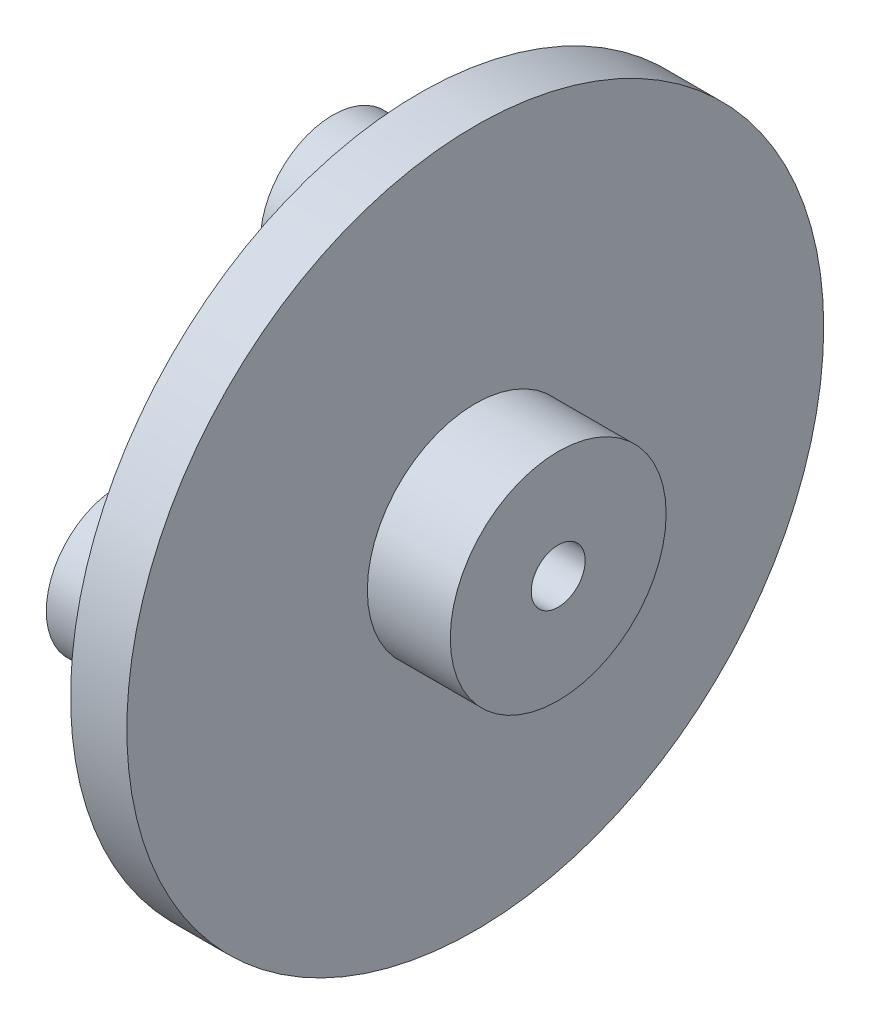
ISO-10303-21;
HEADER;
FILE_DESCRIPTION(('STEP AP214'),'2;1');
FILE_NAME('part.step','',(''),(''),'','','');
FILE_SCHEMA(('AUTOMOTIVE_DESIGN { 1 0 10303 214 1 1 1 1 }'));
ENDSEC;
DATA;
#1=APPLICATION_CONTEXT('core data for automotive mechanical design processes');
#2=APPLICATION_PROTOCOL_DEFINITION('international standard','automotive_design',2000,#1);
#3=PRODUCT_CONTEXT('',#1,'mechanical');
#4=PRODUCT('Part','Part','',(#3));
#5=PRODUCT_RELATED_PRODUCT_CATEGORY('part','',(#4));
#6=PRODUCT_DEFINITION_FORMATION('','',#4);
#7=PRODUCT_DEFINITION_CONTEXT('part definition',#1,'design');
#8=PRODUCT_DEFINITION('design','',#6,#7);
#9=PRODUCT_DEFINITION_SHAPE('','',#8);
#10=(LENGTH_UNIT() NAMED_UNIT(*) SI_UNIT(.MILLI.,.METRE.));
#11=(NAMED_UNIT(*) PLANE_ANGLE_UNIT() SI_UNIT($,.RADIAN.));
#12=(NAMED_UNIT(*) SI_UNIT($,.STERADIAN.) SOLID_ANGLE_UNIT());
#13=UNCERTAINTY_MEASURE_WITH_UNIT(LENGTH_MEASURE(1.E-05),#10,'distance_accuracy_value','');
#14=(GEOMETRIC_REPRESENTATION_CONTEXT(3) GLOBAL_UNCERTAINTY_ASSIGNED_CONTEXT((#13)) GLOBAL_UNIT_ASSIGNED_CONTEXT((#10,
#11,#12)) REPRESENTATION_CONTEXT('',''));
#15=CARTESIAN_POINT('',(0.,0.,0.));
#16=DIRECTION('',(0.,0.,1.));
#17=DIRECTION('',(1.,0.,0.));
#18=AXIS2_PLACEMENT_3D('',#15,#16,#17);
#19=CARTESIAN_POINT('',(-8.1873872368468,0.,0.));
#20=DIRECTION('',(1.,0.,0.));
#21=DIRECTION('',(0.,0.,-1.));
#22=AXIS2_PLACEMENT_3D('',#19,#20,#21);
#23=PLANE('',#22);
#24=CARTESIAN_POINT('',(-8.1873872368468,1.3197799460827E-13,-12.6));
#25=DIRECTION('',(1.,0.,0.));
#26=DIRECTION('',(0.,0.,-1.));
#27=AXIS2_PLACEMENT_3D('',#24,#25,#26);
#28=CIRCLE('',#27,4.25);
#29=CARTESIAN_POINT('',(-8.1873872368468,1.3197799460827E-13,-16.85));
#30=VERTEX_POINT('',#29);
#31=EDGE_CURVE('E10',#30,#30,#28,.F.);
#32=ORIENTED_EDGE('',*,*,#31,.F.);
#33=EDGE_LOOP('',(#32));
#34=FACE_BOUND('',#33,.T.);
#35=CARTESIAN_POINT('',(-8.1873872368468,-12.6,0.));
#36=DIRECTION('',(1.,0.,0.));
#37=DIRECTION('',(0.,0.,-1.));
#38=AXIS2_PLACEMENT_3D('',#35,#36,#37);
#39=CIRCLE('',#38,4.25);
#40=CARTESIAN_POINT('',(-8.1873872368468,-12.6,-4.25000000000009));
#41=VERTEX_POINT('',#40);
#42=EDGE_CURVE('E52',#41,#41,#39,.F.);
#43=ORIENTED_EDGE('',*,*,#42,.F.);
#44=EDGE_LOOP('',(#43));
#45=FACE_BOUND('',#44,.T.);
#46=CARTESIAN_POINT('',(-8.1873872368468,0.,12.6));
#47=DIRECTION('',(1.,0.,0.));
#48=DIRECTION('',(0.,0.,-1.));
#49=AXIS2_PLACEMENT_3D('',#46,#47,#48);
#50=CIRCLE('',#49,4.25);
#51=CARTESIAN_POINT('',(-8.1873872368468,0.,8.35));
#52=VERTEX_POINT('',#51);
#53=EDGE_CURVE('E57',#52,#52,#50,.F.);
#54=ORIENTED_EDGE('',*,*,#53,.F.);
#55=EDGE_LOOP('',(#54));
#56=FACE_BOUND('',#55,.T.);
#57=CARTESIAN_POINT('',(-8.1873872368468,12.6,0.));
#58=DIRECTION('',(1.,0.,0.));
#59=DIRECTION('',(0.,0.,-1.));
#60=AXIS2_PLACEMENT_3D('',#57,#58,#59);
#61=CIRCLE('',#60,4.25);
#62=CARTESIAN_POINT('',(-8.1873872368468,12.6,-4.25));
#63=VERTEX_POINT('',#62);
#64=EDGE_CURVE('E62',#63,#63,#61,.F.);
#65=ORIENTED_EDGE('',*,*,#64,.F.);
#66=EDGE_LOOP('',(#65));
#67=FACE_BOUND('',#66,.T.);
#68=CARTESIAN_POINT('',(-8.1873872368468,0.,0.));
#69=DIRECTION('',(1.,0.,0.));
#70=DIRECTION('',(0.,0.,-1.));
#71=AXIS2_PLACEMENT_3D('',#68,#69,#70);
#72=CIRCLE('',#71,20.5);
#73=CARTESIAN_POINT('',(-8.1873872368468,0.,-20.5));
#74=VERTEX_POINT('',#73);
#75=EDGE_CURVE('E88',#74,#74,#72,.T.);
#76=ORIENTED_EDGE('',*,*,#75,.F.);
#77=EDGE_LOOP('',(#76));
#78=FACE_BOUND('',#77,.T.);
#79=CARTESIAN_POINT('',(-8.1873872368468,0.,0.));
#80=DIRECTION('',(1.,0.,0.));
#81=DIRECTION('',(0.,0.,-1.));
#82=AXIS2_PLACEMENT_3D('',#79,#80,#81);
#83=CIRCLE('',#82,1.5875);
#84=CARTESIAN_POINT('',(-8.1873872368468,0.,-1.5875));
#85=VERTEX_POINT('',#84);
#86=EDGE_CURVE('E68',#85,#85,#83,.T.);
#87=ORIENTED_EDGE('',*,*,#86,.T.);
#88=EDGE_LOOP('',(#87));
#89=FACE_BOUND('',#88,.T.);
#90=ADVANCED_FACE('F45',(#34,#45,#56,#67,#78,#89),#23,.F.);
#91=CARTESIAN_POINT('',(0.,0.,0.));
#92=DIRECTION('',(1.,0.,0.));
#93=DIRECTION('',(0.,0.,-1.));
#94=AXIS2_PLACEMENT_3D('',#91,#92,#93);
#95=CYLINDRICAL_SURFACE('',#94,1.5875);
#96=CARTESIAN_POINT('',(0.,0.,0.));
#97=DIRECTION('',(1.,0.,0.));
#98=DIRECTION('',(0.,0.,-1.));
#99=AXIS2_PLACEMENT_3D('',#96,#97,#98);
#100=CIRCLE('',#99,1.5875);
#101=CARTESIAN_POINT('',(0.,0.,-1.5875));
#102=VERTEX_POINT('',#101);
#103=EDGE_CURVE('E72',#102,#102,#100,.T.);
#104=ORIENTED_EDGE('',*,*,#103,.T.);
#105=EDGE_LOOP('',(#104));
#106=FACE_BOUND('',#105,.T.);
#107=ORIENTED_EDGE('',*,*,#86,.F.);
#108=EDGE_LOOP('',(#107));
#109=FACE_BOUND('',#108,.T.);
#110=ADVANCED_FACE('F124',(#106,#109),#95,.F.);
#111=CARTESIAN_POINT('',(0.,0.,0.));
#112=DIRECTION('',(1.,0.,0.));
#113=DIRECTION('',(0.,0.,-1.));
#114=AXIS2_PLACEMENT_3D('',#111,#112,#113);
#115=PLANE('',#114);
#116=CARTESIAN_POINT('',(0.,0.,0.));
#117=DIRECTION('',(1.,0.,0.));
#118=DIRECTION('',(0.,0.,-1.));
#119=AXIS2_PLACEMENT_3D('',#116,#117,#118);
#120=CIRCLE('',#119,6.35);
#121=CARTESIAN_POINT('',(0.,0.,-6.35));
#122=VERTEX_POINT('',#121);
#123=EDGE_CURVE('E76',#122,#122,#120,.T.);
#124=ORIENTED_EDGE('',*,*,#123,.T.);
#125=EDGE_LOOP('',(#124));
#126=FACE_BOUND('',#125,.T.);
#127=ORIENTED_EDGE('',*,*,#103,.F.);
#128=EDGE_LOOP('',(#127));
#129=FACE_BOUND('',#128,.T.);
#130=ADVANCED_FACE('F131',(#126,#129),#115,.T.);
#131=CARTESIAN_POINT('',(0.,0.,0.));
#132=DIRECTION('',(1.,0.,0.));
#133=DIRECTION('',(0.,0.,-1.));
#134=AXIS2_PLACEMENT_3D('',#131,#132,#133);
#135=CYLINDRICAL_SURFACE('',#134,6.35);
#136=CARTESIAN_POINT('',(-4.87911158009766,0.,0.));
#137=DIRECTION('',(1.,0.,0.));
#138=DIRECTION('',(0.,0.,-1.));
#139=AXIS2_PLACEMENT_3D('',#136,#137,#138);
#140=CIRCLE('',#139,6.35);
#141=CARTESIAN_POINT('',(-4.87911158009766,0.,-6.35));
#142=VERTEX_POINT('',#141);
#143=EDGE_CURVE('E80',#142,#142,#140,.T.);
#144=ORIENTED_EDGE('',*,*,#143,.T.);
#145=EDGE_LOOP('',(#144));
#146=FACE_BOUND('',#145,.T.);
#147=ORIENTED_EDGE('',*,*,#123,.F.);
#148=EDGE_LOOP('',(#147));
#149=FACE_BOUND('',#148,.T.);
#150=ADVANCED_FACE('F153',(#146,#149),#135,.T.);
#151=CARTESIAN_POINT('',(-4.87911158009766,0.,0.));
#152=DIRECTION('',(1.,0.,0.));
#153=DIRECTION('',(0.,0.,-1.));
#154=AXIS2_PLACEMENT_3D('',#151,#152,#153);
#155=PLANE('',#154);
#156=CARTESIAN_POINT('',(-4.87911158009766,0.,0.));
#157=DIRECTION('',(1.,0.,0.));
#158=DIRECTION('',(0.,0.,-1.));
#159=AXIS2_PLACEMENT_3D('',#156,#157,#158);
#160=CIRCLE('',#159,20.5);
#161=CARTESIAN_POINT('',(-4.87911158009766,0.,-20.5));
#162=VERTEX_POINT('',#161);
#163=EDGE_CURVE('E84',#162,#162,#160,.T.);
#164=ORIENTED_EDGE('',*,*,#163,.T.);
#165=EDGE_LOOP('',(#164));
#166=FACE_BOUND('',#165,.T.);
#167=ORIENTED_EDGE('',*,*,#143,.F.);
#168=EDGE_LOOP('',(#167));
#169=FACE_BOUND('',#168,.T.);
#170=ADVANCED_FACE('F147',(#166,#169),#155,.T.);
#171=CARTESIAN_POINT('',(0.,0.,0.));
#172=DIRECTION('',(1.,0.,0.));
#173=DIRECTION('',(0.,0.,-1.));
#174=AXIS2_PLACEMENT_3D('',#171,#172,#173);
#175=CYLINDRICAL_SURFACE('',#174,20.5);
#176=ORIENTED_EDGE('',*,*,#75,.T.);
#177=EDGE_LOOP('',(#176));
#178=FACE_BOUND('',#177,.T.);
#179=ORIENTED_EDGE('',*,*,#163,.F.);
#180=EDGE_LOOP('',(#179));
#181=FACE_BOUND('',#180,.T.);
#182=ADVANCED_FACE('F144',(#178,#181),#175,.T.);
#183=CARTESIAN_POINT('',(-13.2673872368468,12.6,0.));
#184=DIRECTION('',(1.,0.,0.));
#185=DIRECTION('',(0.,0.,-1.));
#186=AXIS2_PLACEMENT_3D('',#183,#184,#185);
#187=CYLINDRICAL_SURFACE('',#186,4.25);
#188=CARTESIAN_POINT('',(-13.2673872368468,12.6,0.));
#189=DIRECTION('',(-1.,0.,0.));
#190=DIRECTION('',(0.,0.,1.));
#191=AXIS2_PLACEMENT_3D('',#188,#189,#190);
#192=CIRCLE('',#191,4.25);
#193=CARTESIAN_POINT('',(-13.2673872368468,12.6,4.25));
#194=VERTEX_POINT('',#193);
#195=EDGE_CURVE('E92',#194,#194,#192,.T.);
#196=ORIENTED_EDGE('',*,*,#195,.F.);
#197=EDGE_LOOP('',(#196));
#198=FACE_BOUND('',#197,.T.);
#199=ORIENTED_EDGE('',*,*,#64,.T.);
#200=EDGE_LOOP('',(#199));
#201=FACE_BOUND('',#200,.T.);
#202=ADVANCED_FACE('F146',(#198,#201),#187,.T.);
#203=CARTESIAN_POINT('',(-13.2673872368468,12.6,0.));
#204=DIRECTION('',(-1.,0.,0.));
#205=DIRECTION('',(0.,0.,1.));
#206=AXIS2_PLACEMENT_3D('',#203,#204,#205);
#207=PLANE('',#206);
#208=ORIENTED_EDGE('',*,*,#195,.T.);
#209=EDGE_LOOP('',(#208));
#210=FACE_BOUND('',#209,.T.);
#211=ADVANCED_FACE('F170',(#210),#207,.T.);
#212=CARTESIAN_POINT('',(-13.2673872368468,0.,12.6));
#213=DIRECTION('',(1.,0.,0.));
#214=DIRECTION('',(0.,0.,-1.));
#215=AXIS2_PLACEMENT_3D('',#212,#213,#214);
#216=CYLINDRICAL_SURFACE('',#215,4.25);
#217=CARTESIAN_POINT('',(-13.2673872368468,0.,12.6));
#218=DIRECTION('',(-1.,0.,0.));
#219=DIRECTION('',(0.,0.,1.));
#220=AXIS2_PLACEMENT_3D('',#217,#218,#219);
#221=CIRCLE('',#220,4.25);
#222=CARTESIAN_POINT('',(-13.2673872368468,0.,16.85));
#223=VERTEX_POINT('',#222);
#224=EDGE_CURVE('E96',#223,#223,#221,.T.);
#225=ORIENTED_EDGE('',*,*,#224,.F.);
#226=EDGE_LOOP('',(#225));
#227=FACE_BOUND('',#226,.T.);
#228=ORIENTED_EDGE('',*,*,#53,.T.);
#229=EDGE_LOOP('',(#228));
#230=FACE_BOUND('',#229,.T.);
#231=ADVANCED_FACE('F174',(#227,#230),#216,.T.);
#232=CARTESIAN_POINT('',(-13.2673872368468,0.,12.6));
#233=DIRECTION('',(-1.,0.,0.));
#234=DIRECTION('',(0.,0.,1.));
#235=AXIS2_PLACEMENT_3D('',#232,#233,#234);
#236=PLANE('',#235);
#237=ORIENTED_EDGE('',*,*,#224,.T.);
#238=EDGE_LOOP('',(#237));
#239=FACE_BOUND('',#238,.T.);
#240=ADVANCED_FACE('F176',(#239),#236,.T.);
#241=CARTESIAN_POINT('',(-13.2673872368468,-12.6,0.));
#242=DIRECTION('',(1.,0.,0.));
#243=DIRECTION('',(0.,0.,-1.));
#244=AXIS2_PLACEMENT_3D('',#241,#242,#243);
#245=CYLINDRICAL_SURFACE('',#244,4.25);
#246=CARTESIAN_POINT('',(-13.2673872368468,-12.6,0.));
#247=DIRECTION('',(-1.,0.,0.));
#248=DIRECTION('',(0.,0.,1.));
#249=AXIS2_PLACEMENT_3D('',#246,#247,#248);
#250=CIRCLE('',#249,4.25);
#251=CARTESIAN_POINT('',(-13.2673872368468,-12.6,4.24999999999991));
#252=VERTEX_POINT('',#251);
#253=EDGE_CURVE('E100',#252,#252,#250,.T.);
#254=ORIENTED_EDGE('',*,*,#253,.F.);
#255=EDGE_LOOP('',(#254));
#256=FACE_BOUND('',#255,.T.);
#257=ORIENTED_EDGE('',*,*,#42,.T.);
#258=EDGE_LOOP('',(#257));
#259=FACE_BOUND('',#258,.T.);
#260=ADVANCED_FACE('F120',(#256,#259),#245,.T.);
#261=CARTESIAN_POINT('',(-13.2673872368468,-12.6,0.));
#262=DIRECTION('',(-1.,0.,0.));
#263=DIRECTION('',(0.,0.,1.));
#264=AXIS2_PLACEMENT_3D('',#261,#262,#263);
#265=PLANE('',#264);
#266=ORIENTED_EDGE('',*,*,#253,.T.);
#267=EDGE_LOOP('',(#266));
#268=FACE_BOUND('',#267,.T.);
#269=ADVANCED_FACE('F113',(#268),#265,.T.);
#270=CARTESIAN_POINT('',(-13.2673872368468,1.3197799460827E-13,-12.6));
#271=DIRECTION('',(1.,0.,0.));
#272=DIRECTION('',(0.,0.,-1.));
#273=AXIS2_PLACEMENT_3D('',#270,#271,#272);
#274=CYLINDRICAL_SURFACE('',#273,4.25);
#275=CARTESIAN_POINT('',(-13.2673872368468,1.3197799460827E-13,-12.6));
#276=DIRECTION('',(-1.,0.,0.));
#277=DIRECTION('',(0.,0.,1.));
#278=AXIS2_PLACEMENT_3D('',#275,#276,#277);
#279=CIRCLE('',#278,4.25);
#280=CARTESIAN_POINT('',(-13.2673872368468,1.3197799460827E-13,-8.35));
#281=VERTEX_POINT('',#280);
#282=EDGE_CURVE('E104',#281,#281,#279,.T.);
#283=ORIENTED_EDGE('',*,*,#282,.F.);
#284=EDGE_LOOP('',(#283));
#285=FACE_BOUND('',#284,.T.);
#286=ORIENTED_EDGE('',*,*,#31,.T.);
#287=EDGE_LOOP('',(#286));
#288=FACE_BOUND('',#287,.T.);
#289=ADVANCED_FACE('F111',(#285,#288),#274,.T.);
#290=CARTESIAN_POINT('',(-13.2673872368468,1.3197799460827E-13,-12.6));
#291=DIRECTION('',(-1.,0.,0.));
#292=DIRECTION('',(0.,0.,1.));
#293=AXIS2_PLACEMENT_3D('',#290,#291,#292);
#294=PLANE('',#293);
#295=ORIENTED_EDGE('',*,*,#282,.T.);
#296=EDGE_LOOP('',(#295));
#297=FACE_BOUND('',#296,.T.);
#298=ADVANCED_FACE('F109',(#297),#294,.T.);
#299=CLOSED_SHELL('',(#90,#110,#130,#150,#170,#182,#202,#211,#231,#240,#260,#269,#289,#298));
#300=MANIFOLD_SOLID_BREP('B2',#299);
#301=ADVANCED_BREP_SHAPE_REPRESENTATION('',(#18,#300),#14);
#302=SHAPE_DEFINITION_REPRESENTATION(#9,#301);
ENDSEC;
END-ISO-10303-21;
